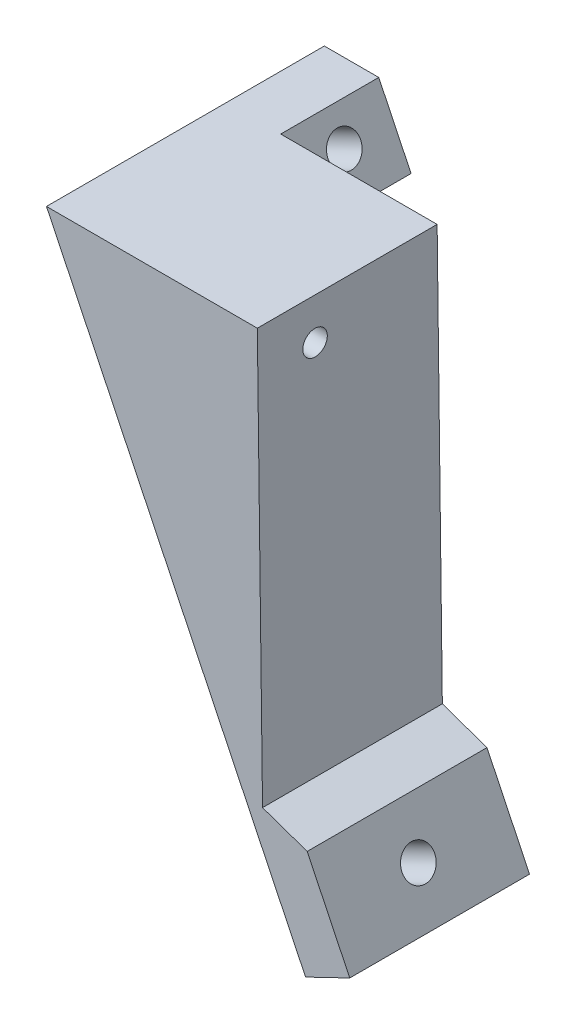
ISO-10303-21;
HEADER;
FILE_DESCRIPTION(('STEP AP214'),'2;1');
FILE_NAME('part.step','',(''),(''),'','','');
FILE_SCHEMA(('AUTOMOTIVE_DESIGN { 1 0 10303 214 1 1 1 1 }'));
ENDSEC;
DATA;
#1=APPLICATION_CONTEXT('core data for automotive mechanical design processes');
#2=APPLICATION_PROTOCOL_DEFINITION('international standard','automotive_design',2000,#1);
#3=PRODUCT_CONTEXT('',#1,'mechanical');
#4=PRODUCT('Part','Part','',(#3));
#5=PRODUCT_RELATED_PRODUCT_CATEGORY('part','',(#4));
#6=PRODUCT_DEFINITION_FORMATION('','',#4);
#7=PRODUCT_DEFINITION_CONTEXT('part definition',#1,'design');
#8=PRODUCT_DEFINITION('design','',#6,#7);
#9=PRODUCT_DEFINITION_SHAPE('','',#8);
#10=(LENGTH_UNIT() NAMED_UNIT(*) SI_UNIT(.MILLI.,.METRE.));
#11=(NAMED_UNIT(*) PLANE_ANGLE_UNIT() SI_UNIT($,.RADIAN.));
#12=(NAMED_UNIT(*) SI_UNIT($,.STERADIAN.) SOLID_ANGLE_UNIT());
#13=UNCERTAINTY_MEASURE_WITH_UNIT(LENGTH_MEASURE(1.E-05),#10,'distance_accuracy_value','');
#14=(GEOMETRIC_REPRESENTATION_CONTEXT(3) GLOBAL_UNCERTAINTY_ASSIGNED_CONTEXT((#13)) GLOBAL_UNIT_ASSIGNED_CONTEXT((#10,
#11,#12)) REPRESENTATION_CONTEXT('',''));
#15=CARTESIAN_POINT('',(0.,0.,0.));
#16=DIRECTION('',(0.,0.,1.));
#17=DIRECTION('',(1.,0.,0.));
#18=AXIS2_PLACEMENT_3D('',#15,#16,#17);
#19=CARTESIAN_POINT('',(-10.4359892167431,24.241346542851,22.));
#20=DIRECTION('',(0.,-1.,0.));
#21=DIRECTION('',(0.,0.,-1.));
#22=AXIS2_PLACEMENT_3D('',#19,#20,#21);
#23=PLANE('',#22);
#24=DIRECTION('',(-1.,0.,0.));
#25=VECTOR('',#24,1.);
#26=CARTESIAN_POINT('',(-10.4359892167431,24.241346542851,0.));
#27=LINE('',#26,#25);
#28=CARTESIAN_POINT('',(-10.4359892167431,24.241346542851,0.));
#29=VERTEX_POINT('',#28);
#30=CARTESIAN_POINT('',(-29.578701160511,24.241346542851,0.));
#31=VERTEX_POINT('',#30);
#32=EDGE_CURVE('E135',#29,#31,#27,.T.);
#33=ORIENTED_EDGE('',*,*,#32,.T.);
#34=DIRECTION('',(0.,0.,-1.));
#35=VECTOR('',#34,1.);
#36=CARTESIAN_POINT('',(-29.578701160511,24.241346542851,0.));
#37=LINE('',#36,#35);
#38=CARTESIAN_POINT('',(-29.578701160511,24.241346542851,-12.));
#39=VERTEX_POINT('',#38);
#40=EDGE_CURVE('E11',#31,#39,#37,.T.);
#41=ORIENTED_EDGE('',*,*,#40,.T.);
#42=DIRECTION('',(-1.,0.,0.));
#43=VECTOR('',#42,1.);
#44=CARTESIAN_POINT('',(-30.8331808679364,24.241346542851,-12.));
#45=LINE('',#44,#43);
#46=CARTESIAN_POINT('',(-36.2386377440524,24.241346542851,-12.));
#47=VERTEX_POINT('',#46);
#48=EDGE_CURVE('E114',#39,#47,#45,.T.);
#49=ORIENTED_EDGE('',*,*,#48,.T.);
#50=DIRECTION('',(0.,0.,-1.));
#51=VECTOR('',#50,1.);
#52=CARTESIAN_POINT('',(-36.2386377440524,24.241346542851,22.));
#53=LINE('',#52,#51);
#54=CARTESIAN_POINT('',(-36.2386377440524,24.241346542851,22.));
#55=VERTEX_POINT('',#54);
#56=EDGE_CURVE('E40',#55,#47,#53,.T.);
#57=ORIENTED_EDGE('',*,*,#56,.F.);
#58=DIRECTION('',(-1.,0.,0.));
#59=VECTOR('',#58,1.);
#60=CARTESIAN_POINT('',(-10.4359892167431,24.241346542851,22.));
#61=LINE('',#60,#59);
#62=CARTESIAN_POINT('',(-10.4359892167431,24.241346542851,22.));
#63=VERTEX_POINT('',#62);
#64=EDGE_CURVE('E137',#63,#55,#61,.T.);
#65=ORIENTED_EDGE('',*,*,#64,.F.);
#66=DIRECTION('',(0.,0.,-1.));
#67=VECTOR('',#66,1.);
#68=CARTESIAN_POINT('',(-10.4359892167431,24.241346542851,22.));
#69=LINE('',#68,#67);
#70=EDGE_CURVE('E112',#63,#29,#69,.T.);
#71=ORIENTED_EDGE('',*,*,#70,.T.);
#72=EDGE_LOOP('',(#33,#41,#49,#57,#65,#71));
#73=FACE_BOUND('',#72,.T.);
#74=ADVANCED_FACE('F33',(#73),#23,.F.);
#75=CARTESIAN_POINT('',(-36.2386377440524,24.241346542851,22.));
#76=DIRECTION('',(0.900909479352666,0.434007039127834,0.));
#77=DIRECTION('',(-0.434007039127834,0.900909479352666,0.));
#78=AXIS2_PLACEMENT_3D('',#75,#76,#77);
#79=PLANE('',#78);
#80=CARTESIAN_POINT('',(-33.6885414970278,18.9478704581709,15.));
#81=DIRECTION('',(0.900909479352666,0.434007039127834,0.));
#82=DIRECTION('',(0.434007039127834,-0.900909479352666,0.));
#83=AXIS2_PLACEMENT_3D('',#80,#81,#82);
#84=ELLIPSE('',#83,1.65506687844373,1.5);
#85=CARTESIAN_POINT('',(-32.9702308215559,17.4568050184183,15.));
#86=VERTEX_POINT('',#85);
#87=EDGE_CURVE('E188',#86,#86,#84,.T.);
#88=ORIENTED_EDGE('',*,*,#87,.T.);
#89=EDGE_LOOP('',(#88));
#90=FACE_BOUND('',#89,.T.);
#91=CARTESIAN_POINT('',(-33.2005884701575,17.9349801873824,-6.));
#92=DIRECTION('',(0.900909479352665,0.434007039127834,0.));
#93=DIRECTION('',(-0.434007039127834,0.900909479352665,0.));
#94=AXIS2_PLACEMENT_3D('',#91,#92,#93);
#95=CIRCLE('',#94,2.);
#96=CARTESIAN_POINT('',(-34.0686025484132,19.7367991460877,-6.));
#97=VERTEX_POINT('',#96);
#98=EDGE_CURVE('E176',#97,#97,#95,.T.);
#99=ORIENTED_EDGE('',*,*,#98,.T.);
#100=EDGE_LOOP('',(#99));
#101=FACE_BOUND('',#100,.T.);
#102=CARTESIAN_POINT('',(-7.13871806643441,-36.164110333265,11.));
#103=DIRECTION('',(0.900909479352665,0.434007039127834,0.));
#104=DIRECTION('',(-0.434007039127834,0.900909479352665,0.));
#105=AXIS2_PLACEMENT_3D('',#102,#103,#104);
#106=CIRCLE('',#105,2.);
#107=CARTESIAN_POINT('',(-8.00673214469008,-34.3622913745596,11.));
#108=VERTEX_POINT('',#107);
#109=EDGE_CURVE('E187',#108,#108,#106,.T.);
#110=ORIENTED_EDGE('',*,*,#109,.T.);
#111=EDGE_LOOP('',(#110));
#112=FACE_BOUND('',#111,.T.);
#113=ORIENTED_EDGE('',*,*,#56,.T.);
#114=DIRECTION('',(0.434007039127834,-0.900909479352665,0.));
#115=VECTOR('',#114,1.);
#116=CARTESIAN_POINT('',(-36.2386377440524,24.241346542851,-12.));
#117=LINE('',#116,#115);
#118=CARTESIAN_POINT('',(-31.0305532745184,13.4304327906191,-12.));
#119=VERTEX_POINT('',#118);
#120=EDGE_CURVE('E105',#47,#119,#117,.T.);
#121=ORIENTED_EDGE('',*,*,#120,.T.);
#122=DIRECTION('',(0.,0.,1.));
#123=VECTOR('',#122,1.);
#124=CARTESIAN_POINT('',(-31.0305532745184,13.4304327906191,0.));
#125=LINE('',#124,#123);
#126=CARTESIAN_POINT('',(-31.0305532745184,13.4304327906191,0.));
#127=VERTEX_POINT('',#126);
#128=EDGE_CURVE('E122',#119,#127,#125,.T.);
#129=ORIENTED_EDGE('',*,*,#128,.T.);
#130=DIRECTION('',(0.434007039127834,-0.900909479352665,0.));
#131=VECTOR('',#130,1.);
#132=CARTESIAN_POINT('',(-36.2386377440524,24.241346542851,0.));
#133=LINE('',#132,#131);
#134=CARTESIAN_POINT('',(-4.53467583166741,-41.5695672093809,0.));
#135=VERTEX_POINT('',#134);
#136=EDGE_CURVE('E144',#127,#135,#133,.T.);
#137=ORIENTED_EDGE('',*,*,#136,.T.);
#138=DIRECTION('',(0.,0.,1.));
#139=VECTOR('',#138,1.);
#140=CARTESIAN_POINT('',(-4.53467583166741,-41.5695672093809,0.));
#141=LINE('',#140,#139);
#142=CARTESIAN_POINT('',(-4.53467583166741,-41.5695672093809,22.));
#143=VERTEX_POINT('',#142);
#144=EDGE_CURVE('E173',#135,#143,#141,.T.);
#145=ORIENTED_EDGE('',*,*,#144,.T.);
#146=DIRECTION('',(0.434007039127834,-0.900909479352665,0.));
#147=VECTOR('',#146,1.);
#148=CARTESIAN_POINT('',(-36.2386377440524,24.241346542851,22.));
#149=LINE('',#148,#147);
#150=EDGE_CURVE('E108',#55,#143,#149,.T.);
#151=ORIENTED_EDGE('',*,*,#150,.F.);
#152=EDGE_LOOP('',(#113,#121,#129,#137,#145,#151));
#153=FACE_BOUND('',#152,.T.);
#154=ADVANCED_FACE('F102',(#90,#101,#112,#153),#79,.F.);
#155=CARTESIAN_POINT('',(-9.74276030120141,-30.758653457149,22.));
#156=DIRECTION('',(-0.999920577011888,-0.0126031610405405,0.));
#157=DIRECTION('',(0.0126031610405405,-0.999920577011888,0.));
#158=AXIS2_PLACEMENT_3D('',#155,#156,#157);
#159=PLANE('',#158);
#160=CARTESIAN_POINT('',(-10.3729734115404,19.2417436577916,15.));
#161=DIRECTION('',(0.999920577011888,0.0126031610405405,0.));
#162=DIRECTION('',(-0.0126031610405405,0.999920577011888,0.));
#163=AXIS2_PLACEMENT_3D('',#160,#161,#162);
#164=CIRCLE('',#163,1.5);
#165=CARTESIAN_POINT('',(-10.3918781531012,20.7416245233094,15.));
#166=VERTEX_POINT('',#165);
#167=EDGE_CURVE('E117',#166,#166,#164,.T.);
#168=ORIENTED_EDGE('',*,*,#167,.F.);
#169=EDGE_LOOP('',(#168));
#170=FACE_BOUND('',#169,.T.);
#171=DIRECTION('',(-0.0126031610405405,0.999920577011888,0.));
#172=VECTOR('',#171,1.);
#173=CARTESIAN_POINT('',(-9.74276030120141,-30.758653457149,22.));
#174=LINE('',#173,#172);
#175=CARTESIAN_POINT('',(-9.79962075744262,-26.2474090137135,22.));
#176=VERTEX_POINT('',#175);
#177=EDGE_CURVE('E141',#176,#63,#174,.T.);
#178=ORIENTED_EDGE('',*,*,#177,.F.);
#179=DIRECTION('',(0.,0.,-1.));
#180=VECTOR('',#179,1.);
#181=CARTESIAN_POINT('',(-9.79962075744262,-26.2474090137135,22.));
#182=LINE('',#181,#180);
#183=CARTESIAN_POINT('',(-9.79962075744262,-26.2474090137135,0.));
#184=VERTEX_POINT('',#183);
#185=EDGE_CURVE('E127',#176,#184,#182,.T.);
#186=ORIENTED_EDGE('',*,*,#185,.T.);
#187=DIRECTION('',(-0.0126031610405405,0.999920577011888,0.));
#188=VECTOR('',#187,1.);
#189=CARTESIAN_POINT('',(-9.74276030120141,-30.758653457149,0.));
#190=LINE('',#189,#188);
#191=EDGE_CURVE('E139',#184,#29,#190,.T.);
#192=ORIENTED_EDGE('',*,*,#191,.T.);
#193=ORIENTED_EDGE('',*,*,#70,.F.);
#194=EDGE_LOOP('',(#178,#186,#192,#193));
#195=FACE_BOUND('',#194,.T.);
#196=ADVANCED_FACE('F204',(#170,#195),#159,.F.);
#197=CARTESIAN_POINT('',(0.,0.,22.));
#198=DIRECTION('',(0.,0.,-1.));
#199=DIRECTION('',(-1.,0.,0.));
#200=AXIS2_PLACEMENT_3D('',#197,#198,#199);
#201=PLANE('',#200);
#202=ORIENTED_EDGE('',*,*,#64,.T.);
#203=ORIENTED_EDGE('',*,*,#150,.T.);
#204=DIRECTION('',(-0.900909479352665,-0.434007039127834,0.));
#205=VECTOR('',#204,1.);
#206=CARTESIAN_POINT('',(0.870781044448587,-38.9655249746139,22.));
#207=LINE('',#206,#205);
#208=CARTESIAN_POINT('',(0.870781044448587,-38.9655249746139,22.));
#209=VERTEX_POINT('',#208);
#210=EDGE_CURVE('E165',#209,#143,#207,.T.);
#211=ORIENTED_EDGE('',*,*,#210,.F.);
#212=DIRECTION('',(-0.434007039127834,0.900909479352665,0.));
#213=VECTOR('',#212,1.);
#214=CARTESIAN_POINT('',(-4.33730342508542,-28.154611222382,22.));
#215=LINE('',#214,#213);
#216=CARTESIAN_POINT('',(-4.33730342508542,-28.154611222382,22.));
#217=VERTEX_POINT('',#216);
#218=EDGE_CURVE('E170',#209,#217,#215,.T.);
#219=ORIENTED_EDGE('',*,*,#218,.T.);
#220=DIRECTION('',(0.944106470959681,-0.329640670263935,0.));
#221=VECTOR('',#220,1.);
#222=CARTESIAN_POINT('',(-4.33730342508542,-28.154611222382,22.));
#223=LINE('',#222,#221);
#224=EDGE_CURVE('E162',#176,#217,#223,.T.);
#225=ORIENTED_EDGE('',*,*,#224,.F.);
#226=ORIENTED_EDGE('',*,*,#177,.T.);
#227=EDGE_LOOP('',(#202,#203,#211,#219,#225,#226));
#228=FACE_BOUND('',#227,.T.);
#229=ADVANCED_FACE('F206',(#228),#201,.F.);
#230=CARTESIAN_POINT('',(0.,0.,0.));
#231=DIRECTION('',(0.,0.,-1.));
#232=DIRECTION('',(-1.,0.,0.));
#233=AXIS2_PLACEMENT_3D('',#230,#231,#232);
#234=PLANE('',#233);
#235=DIRECTION('',(-0.900909479352665,-0.434007039127834,0.));
#236=VECTOR('',#235,1.);
#237=CARTESIAN_POINT('',(-25.6250963984024,16.0344750253861,0.));
#238=LINE('',#237,#236);
#239=CARTESIAN_POINT('',(-25.6250963984024,16.0344750253861,0.));
#240=VERTEX_POINT('',#239);
#241=EDGE_CURVE('E133',#240,#127,#238,.T.);
#242=ORIENTED_EDGE('',*,*,#241,.F.);
#243=DIRECTION('',(-0.434007039127834,0.900909479352665,0.));
#244=VECTOR('',#243,1.);
#245=CARTESIAN_POINT('',(-30.8331808679364,26.8453887776181,0.));
#246=LINE('',#245,#244);
#247=EDGE_CURVE('E125',#240,#31,#246,.T.);
#248=ORIENTED_EDGE('',*,*,#247,.T.);
#249=ORIENTED_EDGE('',*,*,#32,.F.);
#250=ORIENTED_EDGE('',*,*,#191,.F.);
#251=DIRECTION('',(0.944106470959681,-0.329640670263935,0.));
#252=VECTOR('',#251,1.);
#253=CARTESIAN_POINT('',(-4.33730342508542,-28.154611222382,0.));
#254=LINE('',#253,#252);
#255=CARTESIAN_POINT('',(-4.33730342508542,-28.154611222382,0.));
#256=VERTEX_POINT('',#255);
#257=EDGE_CURVE('E47',#184,#256,#254,.T.);
#258=ORIENTED_EDGE('',*,*,#257,.T.);
#259=DIRECTION('',(0.434007039127834,-0.900909479352665,0.));
#260=VECTOR('',#259,1.);
#261=CARTESIAN_POINT('',(-4.33730342508542,-28.154611222382,0.));
#262=LINE('',#261,#260);
#263=CARTESIAN_POINT('',(0.870781044448587,-38.9655249746139,0.));
#264=VERTEX_POINT('',#263);
#265=EDGE_CURVE('E175',#256,#264,#262,.T.);
#266=ORIENTED_EDGE('',*,*,#265,.T.);
#267=DIRECTION('',(-0.900909479352665,-0.434007039127834,0.));
#268=VECTOR('',#267,1.);
#269=CARTESIAN_POINT('',(0.870781044448587,-38.9655249746139,0.));
#270=LINE('',#269,#268);
#271=EDGE_CURVE('E167',#264,#135,#270,.T.);
#272=ORIENTED_EDGE('',*,*,#271,.T.);
#273=ORIENTED_EDGE('',*,*,#136,.F.);
#274=EDGE_LOOP('',(#242,#248,#249,#250,#258,#266,#272,#273));
#275=FACE_BOUND('',#274,.T.);
#276=ADVANCED_FACE('F155',(#275),#234,.T.);
#277=CARTESIAN_POINT('',(-25.6250963984024,16.0344750253861,0.));
#278=DIRECTION('',(0.434007039127834,-0.900909479352665,0.));
#279=DIRECTION('',(0.900909479352665,0.434007039127834,0.));
#280=AXIS2_PLACEMENT_3D('',#277,#278,#279);
#281=PLANE('',#280);
#282=ORIENTED_EDGE('',*,*,#128,.F.);
#283=DIRECTION('',(-0.900909479352665,-0.434007039127834,0.));
#284=VECTOR('',#283,1.);
#285=CARTESIAN_POINT('',(-25.6250963984024,16.0344750253861,-12.));
#286=LINE('',#285,#284);
#287=CARTESIAN_POINT('',(-25.6250963984024,16.0344750253861,-12.));
#288=VERTEX_POINT('',#287);
#289=EDGE_CURVE('E121',#288,#119,#286,.T.);
#290=ORIENTED_EDGE('',*,*,#289,.F.);
#291=DIRECTION('',(0.,0.,1.));
#292=VECTOR('',#291,1.);
#293=CARTESIAN_POINT('',(-25.6250963984024,16.0344750253861,0.));
#294=LINE('',#293,#292);
#295=EDGE_CURVE('E130',#288,#240,#294,.T.);
#296=ORIENTED_EDGE('',*,*,#295,.T.);
#297=ORIENTED_EDGE('',*,*,#241,.T.);
#298=EDGE_LOOP('',(#282,#290,#296,#297));
#299=FACE_BOUND('',#298,.T.);
#300=ADVANCED_FACE('F221',(#299),#281,.T.);
#301=CARTESIAN_POINT('',(-30.8331808679364,26.8453887776181,-12.));
#302=DIRECTION('',(0.,0.,-1.));
#303=DIRECTION('',(0.,1.,0.));
#304=AXIS2_PLACEMENT_3D('',#301,#302,#303);
#305=PLANE('',#304);
#306=ORIENTED_EDGE('',*,*,#48,.F.);
#307=DIRECTION('',(0.434007039127834,-0.900909479352665,0.));
#308=VECTOR('',#307,1.);
#309=CARTESIAN_POINT('',(-30.8331808679364,26.8453887776181,-12.));
#310=LINE('',#309,#308);
#311=EDGE_CURVE('E159',#39,#288,#310,.T.);
#312=ORIENTED_EDGE('',*,*,#311,.T.);
#313=ORIENTED_EDGE('',*,*,#289,.T.);
#314=ORIENTED_EDGE('',*,*,#120,.F.);
#315=EDGE_LOOP('',(#306,#312,#313,#314));
#316=FACE_BOUND('',#315,.T.);
#317=ADVANCED_FACE('F119',(#316),#305,.T.);
#318=CARTESIAN_POINT('',(-14.5288025097088,-6.99915219433874,0.));
#319=DIRECTION('',(0.900909479352665,0.434007039127834,0.));
#320=DIRECTION('',(-0.434007039127834,0.900909479352665,0.));
#321=AXIS2_PLACEMENT_3D('',#318,#319,#320);
#322=PLANE('',#321);
#323=ORIENTED_EDGE('',*,*,#40,.F.);
#324=ORIENTED_EDGE('',*,*,#247,.F.);
#325=ORIENTED_EDGE('',*,*,#295,.F.);
#326=ORIENTED_EDGE('',*,*,#311,.F.);
#327=EDGE_LOOP('',(#323,#324,#325,#326));
#328=FACE_BOUND('',#327,.T.);
#329=CARTESIAN_POINT('',(-27.7951315940415,20.5390224221494,-6.));
#330=DIRECTION('',(0.900909479352665,0.434007039127834,0.));
#331=DIRECTION('',(-0.434007039127834,0.900909479352665,0.));
#332=AXIS2_PLACEMENT_3D('',#329,#330,#331);
#333=CIRCLE('',#332,2.);
#334=CARTESIAN_POINT('',(-28.6631456722972,22.3408413808547,-6.));
#335=VERTEX_POINT('',#334);
#336=EDGE_CURVE('E191',#335,#335,#333,.T.);
#337=ORIENTED_EDGE('',*,*,#336,.F.);
#338=EDGE_LOOP('',(#337));
#339=FACE_BOUND('',#338,.T.);
#340=ADVANCED_FACE('F222',(#328,#339),#322,.T.);
#341=CARTESIAN_POINT('',(-4.33730342508542,-28.154611222382,22.));
#342=DIRECTION('',(0.329640670263935,0.944106470959681,0.));
#343=DIRECTION('',(-0.944106470959681,0.329640670263935,0.));
#344=AXIS2_PLACEMENT_3D('',#341,#342,#343);
#345=PLANE('',#344);
#346=ORIENTED_EDGE('',*,*,#257,.F.);
#347=ORIENTED_EDGE('',*,*,#185,.F.);
#348=ORIENTED_EDGE('',*,*,#224,.T.);
#349=DIRECTION('',(0.,0.,-1.));
#350=VECTOR('',#349,1.);
#351=CARTESIAN_POINT('',(-4.33730342508542,-28.154611222382,22.));
#352=LINE('',#351,#350);
#353=EDGE_CURVE('E123',#217,#256,#352,.T.);
#354=ORIENTED_EDGE('',*,*,#353,.T.);
#355=EDGE_LOOP('',(#346,#347,#348,#354));
#356=FACE_BOUND('',#355,.T.);
#357=ADVANCED_FACE('F212',(#356),#345,.T.);
#358=CARTESIAN_POINT('',(0.870781044448587,-38.9655249746139,0.));
#359=DIRECTION('',(0.434007039127834,-0.900909479352665,0.));
#360=DIRECTION('',(0.900909479352665,0.434007039127834,0.));
#361=AXIS2_PLACEMENT_3D('',#358,#359,#360);
#362=PLANE('',#361);
#363=ORIENTED_EDGE('',*,*,#144,.F.);
#364=ORIENTED_EDGE('',*,*,#271,.F.);
#365=DIRECTION('',(0.,0.,1.));
#366=VECTOR('',#365,1.);
#367=CARTESIAN_POINT('',(0.870781044448587,-38.9655249746139,0.));
#368=LINE('',#367,#366);
#369=EDGE_CURVE('E179',#264,#209,#368,.T.);
#370=ORIENTED_EDGE('',*,*,#369,.T.);
#371=ORIENTED_EDGE('',*,*,#210,.T.);
#372=EDGE_LOOP('',(#363,#364,#370,#371));
#373=FACE_BOUND('',#372,.T.);
#374=ADVANCED_FACE('F219',(#373),#362,.T.);
#375=CARTESIAN_POINT('',(-14.5288025097088,-6.99915219433874,0.));
#376=DIRECTION('',(-0.900909479352665,-0.434007039127834,0.));
#377=DIRECTION('',(0.434007039127834,-0.900909479352665,0.));
#378=AXIS2_PLACEMENT_3D('',#375,#376,#377);
#379=PLANE('',#378);
#380=CARTESIAN_POINT('',(-1.73326119031842,-33.560068098498,11.));
#381=DIRECTION('',(0.900909479352665,0.434007039127834,0.));
#382=DIRECTION('',(-0.434007039127834,0.900909479352665,0.));
#383=AXIS2_PLACEMENT_3D('',#380,#381,#382);
#384=CIRCLE('',#383,2.);
#385=CARTESIAN_POINT('',(-2.60127526857409,-31.7582491397926,11.));
#386=VERTEX_POINT('',#385);
#387=EDGE_CURVE('E184',#386,#386,#384,.T.);
#388=ORIENTED_EDGE('',*,*,#387,.F.);
#389=EDGE_LOOP('',(#388));
#390=FACE_BOUND('',#389,.T.);
#391=ORIENTED_EDGE('',*,*,#265,.F.);
#392=ORIENTED_EDGE('',*,*,#353,.F.);
#393=ORIENTED_EDGE('',*,*,#218,.F.);
#394=ORIENTED_EDGE('',*,*,#369,.F.);
#395=EDGE_LOOP('',(#391,#392,#393,#394));
#396=FACE_BOUND('',#395,.T.);
#397=ADVANCED_FACE('F216',(#390,#396),#379,.F.);
#398=CARTESIAN_POINT('',(-7.13871806643441,-36.164110333265,11.));
#399=DIRECTION('',(0.900909479352665,0.434007039127834,0.));
#400=DIRECTION('',(-0.434007039127834,0.900909479352665,0.));
#401=AXIS2_PLACEMENT_3D('',#398,#399,#400);
#402=CYLINDRICAL_SURFACE('',#401,2.);
#403=CARTESIAN_POINT('',(-8.00673214469008,-34.3622913745596,11.));
#404=CARTESIAN_POINT('',(-7.95042530223054,-34.3351659346141,11.));
#405=CARTESIAN_POINT('',(-7.894118459771,-34.3080404946686,11.));
#406=CARTESIAN_POINT('',(-7.78150477485191,-34.2537896147777,11.));
#407=CARTESIAN_POINT('',(-7.72519793239237,-34.2266641748322,11.));
#408=CARTESIAN_POINT('',(-7.61258424747329,-34.1724132949412,11.));
#409=CARTESIAN_POINT('',(-7.55627740501375,-34.1452878549957,11.));
#410=CARTESIAN_POINT('',(-7.44366372009467,-34.0910369751047,11.));
#411=CARTESIAN_POINT('',(-7.38735687763512,-34.0639115351592,11.));
#412=CARTESIAN_POINT('',(-7.27474319271604,-34.0096606552683,11.));
#413=CARTESIAN_POINT('',(-7.2184363502565,-33.9825352153228,11.));
#414=CARTESIAN_POINT('',(-7.10582266533742,-33.9282843354318,11.));
#415=CARTESIAN_POINT('',(-7.04951582287787,-33.9011588954863,11.));
#416=CARTESIAN_POINT('',(-6.93690213795879,-33.8469080155953,11.));
#417=CARTESIAN_POINT('',(-6.88059529549925,-33.8197825756498,11.));
#418=CARTESIAN_POINT('',(-6.76798161058017,-33.7655316957588,11.));
#419=CARTESIAN_POINT('',(-6.71167476812063,-33.7384062558134,11.));
#420=CARTESIAN_POINT('',(-6.59906108320154,-33.6841553759224,11.));
#421=CARTESIAN_POINT('',(-6.542754240742,-33.6570299359769,11.));
#422=CARTESIAN_POINT('',(-6.43014055582292,-33.6027790560859,11.));
#423=CARTESIAN_POINT('',(-6.37383371336337,-33.5756536161404,11.));
#424=CARTESIAN_POINT('',(-6.26122002844429,-33.5214027362494,11.));
#425=CARTESIAN_POINT('',(-6.20491318598475,-33.4942772963039,11.));
#426=CARTESIAN_POINT('',(-6.09229950106567,-33.440026416413,11.));
#427=CARTESIAN_POINT('',(-6.03599265860613,-33.4129009764675,11.));
#428=CARTESIAN_POINT('',(-5.92337897368704,-33.3586500965765,11.));
#429=CARTESIAN_POINT('',(-5.8670721312275,-33.331524656631,11.));
#430=CARTESIAN_POINT('',(-5.75445844630842,-33.27727377674,11.));
#431=CARTESIAN_POINT('',(-5.69815160384888,-33.2501483367946,11.));
#432=CARTESIAN_POINT('',(-5.58553791892979,-33.1958974569036,11.));
#433=CARTESIAN_POINT('',(-5.52923107647025,-33.1687720169581,11.));
#434=CARTESIAN_POINT('',(-5.41661739155117,-33.1145211370671,11.));
#435=CARTESIAN_POINT('',(-5.36031054909163,-33.0873956971216,11.));
#436=CARTESIAN_POINT('',(-5.24769686417254,-33.0331448172306,11.));
#437=CARTESIAN_POINT('',(-5.191390021713,-33.0060193772851,11.));
#438=CARTESIAN_POINT('',(-5.07877633679392,-32.9517684973942,11.));
#439=CARTESIAN_POINT('',(-5.02246949433438,-32.9246430574487,11.));
#440=CARTESIAN_POINT('',(-4.90985580941529,-32.8703921775577,11.));
#441=CARTESIAN_POINT('',(-4.85354896695575,-32.8432667376122,11.));
#442=CARTESIAN_POINT('',(-4.74093528203667,-32.7890158577212,11.));
#443=CARTESIAN_POINT('',(-4.68462843957713,-32.7618904177757,11.));
#444=CARTESIAN_POINT('',(-4.57201475465804,-32.7076395378848,11.));
#445=CARTESIAN_POINT('',(-4.5157079121985,-32.6805140979393,11.));
#446=CARTESIAN_POINT('',(-4.40309422727942,-32.6262632180483,11.));
#447=CARTESIAN_POINT('',(-4.34678738481988,-32.5991377781028,11.));
#448=CARTESIAN_POINT('',(-4.2341736999008,-32.5448868982118,11.));
#449=CARTESIAN_POINT('',(-4.17786685744125,-32.5177614582663,11.));
#450=CARTESIAN_POINT('',(-4.06525317252217,-32.4635105783753,11.));
#451=CARTESIAN_POINT('',(-4.00894633006263,-32.4363851384299,11.));
#452=CARTESIAN_POINT('',(-3.89633264514355,-32.3821342585389,11.));
#453=CARTESIAN_POINT('',(-3.840025802684,-32.3550088185934,11.));
#454=CARTESIAN_POINT('',(-3.72741211776492,-32.3007579387024,11.));
#455=CARTESIAN_POINT('',(-3.67110527530538,-32.2736324987569,11.));
#456=CARTESIAN_POINT('',(-3.5584915903863,-32.2193816188659,11.));
#457=CARTESIAN_POINT('',(-3.50218474792675,-32.1922561789205,11.));
#458=CARTESIAN_POINT('',(-3.38957106300767,-32.1380052990295,11.));
#459=CARTESIAN_POINT('',(-3.33326422054813,-32.110879859084,11.));
#460=CARTESIAN_POINT('',(-3.22065053562905,-32.056628979193,11.));
#461=CARTESIAN_POINT('',(-3.1643436931695,-32.0295035392475,11.));
#462=CARTESIAN_POINT('',(-3.05173000825042,-31.9752526593565,11.));
#463=CARTESIAN_POINT('',(-2.99542316579088,-31.948127219411,11.));
#464=CARTESIAN_POINT('',(-2.8828094808718,-31.8938763395201,11.));
#465=CARTESIAN_POINT('',(-2.82650263841226,-31.8667508995746,11.));
#466=CARTESIAN_POINT('',(-2.71388895349317,-31.8125000196836,11.));
#467=CARTESIAN_POINT('',(-2.65758211103363,-31.7853745797381,11.));
#468=CARTESIAN_POINT('',(-2.60127526857409,-31.7582491397926,11.));
#469=B_SPLINE_CURVE_WITH_KNOTS('',3,(#403,#404,#405,#406,#407,#408,#409,#410,#411,#412,#413,
#414,#415,#416,#417,#418,#419,#420,#421,#422,#423,#424,#425,#426,#427,#428,#429,#430,#431,#432,
#433,#434,#435,#436,#437,#438,#439,#440,#441,#442,#443,#444,#445,#446,#447,#448,#449,#450,#451,
#452,#453,#454,#455,#456,#457,#458,#459,#460,#461,#462,#463,#464,#465,#466,#467,#468),
.UNSPECIFIED.,.F.,.F.,(4,2,2,2,2,2,2,2,2,2,2,2,2,2,2,2,2,2,2,2,2,2,2,2,2,2,2,2,2,2,2,2,4),(0.,
0.187500000000002,0.374999999999999,0.5625,0.750000000000002,0.937499999999999,1.125,1.3125,1.5,
1.6875,1.875,2.0625,2.25,2.4375,2.625,2.8125,3.,3.1875,3.375,3.5625,3.75,3.9375,4.125,4.3125,
4.5,4.6875,4.875,5.0625,5.25,5.4375,5.625,5.8125,6.),.UNSPECIFIED.);
#470=EDGE_CURVE('BSEAM230',#108,#386,#469,.T.);
#471=ORIENTED_EDGE('',*,*,#109,.F.);
#472=ORIENTED_EDGE('',*,*,#387,.T.);
#473=ORIENTED_EDGE('',*,*,#470,.T.);
#474=ORIENTED_EDGE('',*,*,#470,.F.);
#475=EDGE_LOOP('',(#471,#473,#472,#474));
#476=FACE_BOUND('',#475,.T.);
#477=ADVANCED_FACE('F230',(#476),#402,.F.);
#478=CARTESIAN_POINT('',(-33.2005884701575,17.9349801873824,-6.));
#479=DIRECTION('',(0.900909479352665,0.434007039127834,0.));
#480=DIRECTION('',(-0.434007039127834,0.900909479352665,0.));
#481=AXIS2_PLACEMENT_3D('',#478,#479,#480);
#482=CYLINDRICAL_SURFACE('',#481,2.);
#483=CARTESIAN_POINT('',(-34.0686025484132,19.7367991460877,-6.));
#484=CARTESIAN_POINT('',(-34.0122957059537,19.7639245860332,-6.));
#485=CARTESIAN_POINT('',(-33.9559888634941,19.7910500259787,-6.));
#486=CARTESIAN_POINT('',(-33.843375178575,19.8453009058697,-6.));
#487=CARTESIAN_POINT('',(-33.7870683361155,19.8724263458152,-6.));
#488=CARTESIAN_POINT('',(-33.6744546511964,19.9266772257061,-6.));
#489=CARTESIAN_POINT('',(-33.6181478087369,19.9538026656516,-6.));
#490=CARTESIAN_POINT('',(-33.5055341238178,20.0080535455426,-6.));
#491=CARTESIAN_POINT('',(-33.4492272813583,20.0351789854881,-6.));
#492=CARTESIAN_POINT('',(-33.3366135964392,20.0894298653791,-6.));
#493=CARTESIAN_POINT('',(-33.2803067539796,20.1165553053246,-6.));
#494=CARTESIAN_POINT('',(-33.1676930690605,20.1708061852156,-6.));
#495=CARTESIAN_POINT('',(-33.111386226601,20.197931625161,-6.));
#496=CARTESIAN_POINT('',(-32.9987725416819,20.252182505052,-6.));
#497=CARTESIAN_POINT('',(-32.9424656992224,20.2793079449975,-6.));
#498=CARTESIAN_POINT('',(-32.8298520143033,20.3335588248885,-6.));
#499=CARTESIAN_POINT('',(-32.7735451718438,20.360684264834,-6.));
#500=CARTESIAN_POINT('',(-32.6609314869247,20.414935144725,-6.));
#501=CARTESIAN_POINT('',(-32.6046246444651,20.4420605846705,-6.));
#502=CARTESIAN_POINT('',(-32.4920109595461,20.4963114645614,-6.));
#503=CARTESIAN_POINT('',(-32.4357041170865,20.5234369045069,-6.));
#504=CARTESIAN_POINT('',(-32.3230904321674,20.5776877843979,-6.));
#505=CARTESIAN_POINT('',(-32.2667835897079,20.6048132243434,-6.));
#506=CARTESIAN_POINT('',(-32.1541699047888,20.6590641042344,-6.));
#507=CARTESIAN_POINT('',(-32.0978630623293,20.6861895441799,-6.));
#508=CARTESIAN_POINT('',(-31.9852493774102,20.7404404240708,-6.));
#509=CARTESIAN_POINT('',(-31.9289425349506,20.7675658640163,-6.));
#510=CARTESIAN_POINT('',(-31.8163288500315,20.8218167439073,-6.));
#511=CARTESIAN_POINT('',(-31.760022007572,20.8489421838528,-6.));
#512=CARTESIAN_POINT('',(-31.6474083226529,20.9031930637438,-6.));
#513=CARTESIAN_POINT('',(-31.5911014801934,20.9303185036893,-6.));
#514=CARTESIAN_POINT('',(-31.4784877952743,20.9845693835802,-6.));
#515=CARTESIAN_POINT('',(-31.4221809528148,21.0116948235257,-6.));
#516=CARTESIAN_POINT('',(-31.3095672678957,21.0659457034167,-6.));
#517=CARTESIAN_POINT('',(-31.2532604254361,21.0930711433622,-6.));
#518=CARTESIAN_POINT('',(-31.140646740517,21.1473220232532,-6.));
#519=CARTESIAN_POINT('',(-31.0843398980575,21.1744474631987,-6.));
#520=CARTESIAN_POINT('',(-30.9717262131384,21.2286983430896,-6.));
#521=CARTESIAN_POINT('',(-30.9154193706789,21.2558237830351,-6.));
#522=CARTESIAN_POINT('',(-30.8028056857598,21.3100746629261,-6.));
#523=CARTESIAN_POINT('',(-30.7464988433003,21.3372001028716,-6.));
#524=CARTESIAN_POINT('',(-30.6338851583812,21.3914509827626,-6.));
#525=CARTESIAN_POINT('',(-30.5775783159216,21.4185764227081,-6.));
#526=CARTESIAN_POINT('',(-30.4649646310025,21.4728273025991,-6.));
#527=CARTESIAN_POINT('',(-30.408657788543,21.4999527425445,-6.));
#528=CARTESIAN_POINT('',(-30.2960441036239,21.5542036224355,-6.));
#529=CARTESIAN_POINT('',(-30.2397372611644,21.581329062381,-6.));
#530=CARTESIAN_POINT('',(-30.1271235762453,21.635579942272,-6.));
#531=CARTESIAN_POINT('',(-30.0708167337858,21.6627053822175,-6.));
#532=CARTESIAN_POINT('',(-29.9582030488667,21.7169562621085,-6.));
#533=CARTESIAN_POINT('',(-29.9018962064071,21.744081702054,-6.));
#534=CARTESIAN_POINT('',(-29.7892825214881,21.7983325819449,-6.));
#535=CARTESIAN_POINT('',(-29.7329756790285,21.8254580218904,-6.));
#536=CARTESIAN_POINT('',(-29.6203619941094,21.8797089017814,-6.));
#537=CARTESIAN_POINT('',(-29.5640551516499,21.9068343417269,-6.));
#538=CARTESIAN_POINT('',(-29.4514414667308,21.9610852216179,-6.));
#539=CARTESIAN_POINT('',(-29.3951346242713,21.9882106615634,-6.));
#540=CARTESIAN_POINT('',(-29.2825209393522,22.0424615414543,-6.));
#541=CARTESIAN_POINT('',(-29.2262140968926,22.0695869813998,-6.));
#542=CARTESIAN_POINT('',(-29.1136004119736,22.1238378612908,-6.));
#543=CARTESIAN_POINT('',(-29.057293569514,22.1509633012363,-6.));
#544=CARTESIAN_POINT('',(-28.9446798845949,22.2052141811273,-6.));
#545=CARTESIAN_POINT('',(-28.8883730421354,22.2323396210728,-6.));
#546=CARTESIAN_POINT('',(-28.7757593572163,22.2865905009637,-6.));
#547=CARTESIAN_POINT('',(-28.7194525147568,22.3137159409092,-6.));
#548=CARTESIAN_POINT('',(-28.6631456722972,22.3408413808547,-6.));
#549=B_SPLINE_CURVE_WITH_KNOTS('',3,(#483,#484,#485,#486,#487,#488,#489,#490,#491,#492,#493,
#494,#495,#496,#497,#498,#499,#500,#501,#502,#503,#504,#505,#506,#507,#508,#509,#510,#511,#512,
#513,#514,#515,#516,#517,#518,#519,#520,#521,#522,#523,#524,#525,#526,#527,#528,#529,#530,#531,
#532,#533,#534,#535,#536,#537,#538,#539,#540,#541,#542,#543,#544,#545,#546,#547,#548),
.UNSPECIFIED.,.F.,.F.,(4,2,2,2,2,2,2,2,2,2,2,2,2,2,2,2,2,2,2,2,2,2,2,2,2,2,2,2,2,2,2,2,4),(0.,
0.187500000000005,0.375000000000003,0.562500000000002,0.750000000000006,0.937500000000005,1.125,
1.3125,1.50000000000001,1.6875,1.875,2.0625,2.25000000000001,2.4375,2.625,2.8125,
3.00000000000001,3.1875,3.375,3.5625,3.75,3.9375,4.125,4.3125,4.5,4.6875,4.875,5.0625,5.25,
5.4375,5.625,5.8125,6.),.UNSPECIFIED.);
#550=EDGE_CURVE('BSEAM228',#97,#335,#549,.T.);
#551=ORIENTED_EDGE('',*,*,#98,.F.);
#552=ORIENTED_EDGE('',*,*,#336,.T.);
#553=ORIENTED_EDGE('',*,*,#550,.T.);
#554=ORIENTED_EDGE('',*,*,#550,.F.);
#555=EDGE_LOOP('',(#551,#553,#552,#554));
#556=FACE_BOUND('',#555,.T.);
#557=ADVANCED_FACE('F228',(#556),#482,.F.);
#558=CARTESIAN_POINT('',(-46.3701141839683,18.7880298603321,15.));
#559=DIRECTION('',(0.999920577011888,0.0126031610405405,0.));
#560=DIRECTION('',(-0.0126031610405405,0.999920577011888,0.));
#561=AXIS2_PLACEMENT_3D('',#558,#559,#560);
#562=CYLINDRICAL_SURFACE('',#561,1.5);
#563=ORIENTED_EDGE('',*,*,#167,.T.);
#564=EDGE_LOOP('',(#563));
#565=FACE_BOUND('',#564,.T.);
#566=ORIENTED_EDGE('',*,*,#87,.F.);
#567=EDGE_LOOP('',(#566));
#568=FACE_BOUND('',#567,.T.);
#569=ADVANCED_FACE('F201',(#565,#568),#562,.F.);
#570=CLOSED_SHELL('',(#74,#154,#196,#229,#276,#300,#317,#340,#357,#374,#397,#477,#557,#569));
#571=MANIFOLD_SOLID_BREP('B2',#570);
#572=ADVANCED_BREP_SHAPE_REPRESENTATION('',(#18,#571),#14);
#573=SHAPE_DEFINITION_REPRESENTATION(#9,#572);
ENDSEC;
END-ISO-10303-21;
